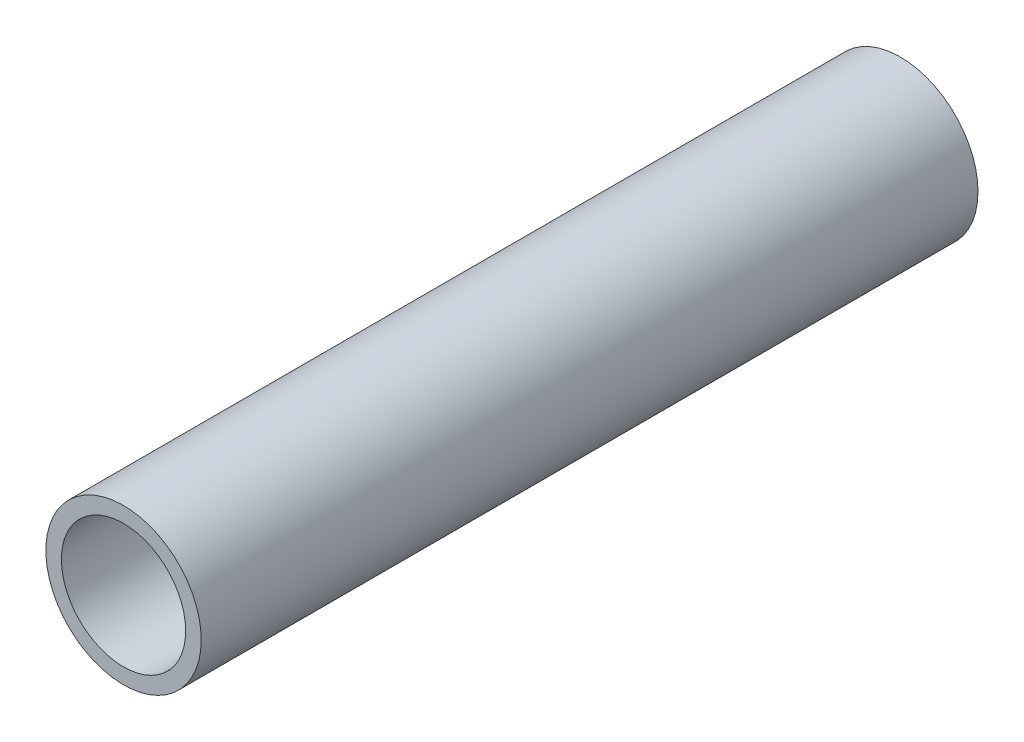
ISO-10303-21;
HEADER;
FILE_DESCRIPTION(('STEP AP214'),'2;1');
FILE_NAME('part.step','',(''),(''),'','','');
FILE_SCHEMA(('AUTOMOTIVE_DESIGN { 1 0 10303 214 1 1 1 1 }'));
ENDSEC;
DATA;
#1=APPLICATION_CONTEXT('core data for automotive mechanical design processes');
#2=APPLICATION_PROTOCOL_DEFINITION('international standard','automotive_design',2000,#1);
#3=PRODUCT_CONTEXT('',#1,'mechanical');
#4=PRODUCT('Part','Part','',(#3));
#5=PRODUCT_RELATED_PRODUCT_CATEGORY('part','',(#4));
#6=PRODUCT_DEFINITION_FORMATION('','',#4);
#7=PRODUCT_DEFINITION_CONTEXT('part definition',#1,'design');
#8=PRODUCT_DEFINITION('design','',#6,#7);
#9=PRODUCT_DEFINITION_SHAPE('','',#8);
#10=(LENGTH_UNIT() NAMED_UNIT(*) SI_UNIT(.MILLI.,.METRE.));
#11=(NAMED_UNIT(*) PLANE_ANGLE_UNIT() SI_UNIT($,.RADIAN.));
#12=(NAMED_UNIT(*) SI_UNIT($,.STERADIAN.) SOLID_ANGLE_UNIT());
#13=UNCERTAINTY_MEASURE_WITH_UNIT(LENGTH_MEASURE(1.E-05),#10,'distance_accuracy_value','');
#14=(GEOMETRIC_REPRESENTATION_CONTEXT(3) GLOBAL_UNCERTAINTY_ASSIGNED_CONTEXT((#13)) GLOBAL_UNIT_ASSIGNED_CONTEXT((#10,
#11,#12)) REPRESENTATION_CONTEXT('',''));
#15=CARTESIAN_POINT('',(0.,0.,0.));
#16=DIRECTION('',(0.,0.,1.));
#17=DIRECTION('',(1.,0.,0.));
#18=AXIS2_PLACEMENT_3D('',#15,#16,#17);
#19=CARTESIAN_POINT('',(0.,0.,150.));
#20=DIRECTION('',(0.,0.,1.));
#21=DIRECTION('',(1.,0.,0.));
#22=AXIS2_PLACEMENT_3D('',#19,#20,#21);
#23=PLANE('',#22);
#24=CARTESIAN_POINT('',(0.,0.,150.));
#25=DIRECTION('',(0.,0.,1.));
#26=DIRECTION('',(1.,0.,0.));
#27=AXIS2_PLACEMENT_3D('',#24,#25,#26);
#28=CIRCLE('',#27,15.);
#29=CARTESIAN_POINT('',(15.,0.,150.));
#30=VERTEX_POINT('',#29);
#31=EDGE_CURVE('E10',#30,#30,#28,.T.);
#32=ORIENTED_EDGE('',*,*,#31,.T.);
#33=EDGE_LOOP('',(#32));
#34=FACE_BOUND('',#33,.T.);
#35=CARTESIAN_POINT('',(0.,0.,150.));
#36=DIRECTION('',(0.,0.,1.));
#37=DIRECTION('',(1.,0.,0.));
#38=AXIS2_PLACEMENT_3D('',#35,#36,#37);
#39=CIRCLE('',#38,12.);
#40=CARTESIAN_POINT('',(12.,0.,150.));
#41=VERTEX_POINT('',#40);
#42=EDGE_CURVE('E50',#41,#41,#39,.T.);
#43=ORIENTED_EDGE('',*,*,#42,.F.);
#44=EDGE_LOOP('',(#43));
#45=FACE_BOUND('',#44,.T.);
#46=ADVANCED_FACE('F37',(#34,#45),#23,.T.);
#47=CARTESIAN_POINT('',(0.,0.,0.));
#48=DIRECTION('',(0.,0.,1.));
#49=DIRECTION('',(1.,0.,0.));
#50=AXIS2_PLACEMENT_3D('',#47,#48,#49);
#51=PLANE('',#50);
#52=CARTESIAN_POINT('',(0.,0.,0.));
#53=DIRECTION('',(0.,0.,1.));
#54=DIRECTION('',(1.,0.,0.));
#55=AXIS2_PLACEMENT_3D('',#52,#53,#54);
#56=CIRCLE('',#55,15.);
#57=CARTESIAN_POINT('',(15.,0.,0.));
#58=VERTEX_POINT('',#57);
#59=EDGE_CURVE('E41',#58,#58,#56,.T.);
#60=ORIENTED_EDGE('',*,*,#59,.F.);
#61=EDGE_LOOP('',(#60));
#62=FACE_BOUND('',#61,.T.);
#63=CARTESIAN_POINT('',(0.,0.,0.));
#64=DIRECTION('',(0.,0.,1.));
#65=DIRECTION('',(1.,0.,0.));
#66=AXIS2_PLACEMENT_3D('',#63,#64,#65);
#67=CIRCLE('',#66,12.);
#68=CARTESIAN_POINT('',(12.,0.,0.));
#69=VERTEX_POINT('',#68);
#70=EDGE_CURVE('E52',#69,#69,#67,.T.);
#71=ORIENTED_EDGE('',*,*,#70,.T.);
#72=EDGE_LOOP('',(#71));
#73=FACE_BOUND('',#72,.T.);
#74=ADVANCED_FACE('F64',(#62,#73),#51,.F.);
#75=CARTESIAN_POINT('',(0.,0.,150.));
#76=DIRECTION('',(0.,0.,-1.));
#77=DIRECTION('',(-1.,0.,0.));
#78=AXIS2_PLACEMENT_3D('',#75,#76,#77);
#79=CYLINDRICAL_SURFACE('',#78,15.);
#80=ORIENTED_EDGE('',*,*,#31,.F.);
#81=EDGE_LOOP('',(#80));
#82=FACE_BOUND('',#81,.T.);
#83=ORIENTED_EDGE('',*,*,#59,.T.);
#84=EDGE_LOOP('',(#83));
#85=FACE_BOUND('',#84,.T.);
#86=ADVANCED_FACE('F39',(#82,#85),#79,.T.);
#87=CARTESIAN_POINT('',(0.,0.,150.));
#88=DIRECTION('',(0.,0.,-1.));
#89=DIRECTION('',(-1.,0.,0.));
#90=AXIS2_PLACEMENT_3D('',#87,#88,#89);
#91=CYLINDRICAL_SURFACE('',#90,12.);
#92=ORIENTED_EDGE('',*,*,#42,.T.);
#93=EDGE_LOOP('',(#92));
#94=FACE_BOUND('',#93,.T.);
#95=ORIENTED_EDGE('',*,*,#70,.F.);
#96=EDGE_LOOP('',(#95));
#97=FACE_BOUND('',#96,.T.);
#98=ADVANCED_FACE('F60',(#94,#97),#91,.F.);
#99=CLOSED_SHELL('',(#46,#74,#86,#98));
#100=MANIFOLD_SOLID_BREP('B2',#99);
#101=ADVANCED_BREP_SHAPE_REPRESENTATION('',(#18,#100),#14);
#102=SHAPE_DEFINITION_REPRESENTATION(#9,#101);
ENDSEC;
END-ISO-10303-21;
